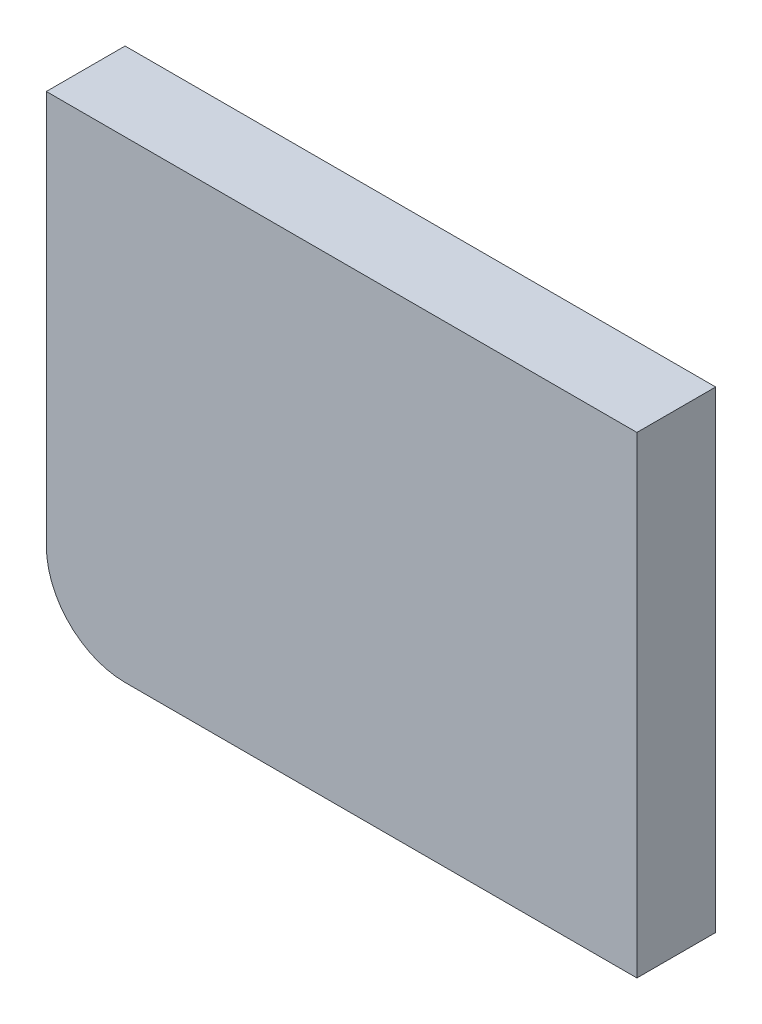
ISO-10303-21;
HEADER;
FILE_DESCRIPTION(('STEP AP214'),'2;1');
FILE_NAME('part.step','',(''),(''),'','','');
FILE_SCHEMA(('AUTOMOTIVE_DESIGN { 1 0 10303 214 1 1 1 1 }'));
ENDSEC;
DATA;
#1=APPLICATION_CONTEXT('core data for automotive mechanical design processes');
#2=APPLICATION_PROTOCOL_DEFINITION('international standard','automotive_design',2000,#1);
#3=PRODUCT_CONTEXT('',#1,'mechanical');
#4=PRODUCT('Part','Part','',(#3));
#5=PRODUCT_RELATED_PRODUCT_CATEGORY('part','',(#4));
#6=PRODUCT_DEFINITION_FORMATION('','',#4);
#7=PRODUCT_DEFINITION_CONTEXT('part definition',#1,'design');
#8=PRODUCT_DEFINITION('design','',#6,#7);
#9=PRODUCT_DEFINITION_SHAPE('','',#8);
#10=(LENGTH_UNIT() NAMED_UNIT(*) SI_UNIT(.MILLI.,.METRE.));
#11=(NAMED_UNIT(*) PLANE_ANGLE_UNIT() SI_UNIT($,.RADIAN.));
#12=(NAMED_UNIT(*) SI_UNIT($,.STERADIAN.) SOLID_ANGLE_UNIT());
#13=UNCERTAINTY_MEASURE_WITH_UNIT(LENGTH_MEASURE(1.E-05),#10,'distance_accuracy_value','');
#14=(GEOMETRIC_REPRESENTATION_CONTEXT(3) GLOBAL_UNCERTAINTY_ASSIGNED_CONTEXT((#13)) GLOBAL_UNIT_ASSIGNED_CONTEXT((#10,
#11,#12)) REPRESENTATION_CONTEXT('',''));
#15=CARTESIAN_POINT('',(0.,0.,0.));
#16=DIRECTION('',(0.,0.,1.));
#17=DIRECTION('',(1.,0.,0.));
#18=AXIS2_PLACEMENT_3D('',#15,#16,#17);
#19=CARTESIAN_POINT('',(-37.821244,0.,2.));
#20=DIRECTION('',(1.,0.,0.));
#21=DIRECTION('',(0.,0.,-1.));
#22=AXIS2_PLACEMENT_3D('',#19,#20,#21);
#23=PLANE('',#22);
#24=DIRECTION('',(0.,-1.,0.));
#25=VECTOR('',#24,1.);
#26=CARTESIAN_POINT('',(-37.821244,0.,0.));
#27=LINE('',#26,#25);
#28=CARTESIAN_POINT('',(-37.821244,4.,0.));
#29=VERTEX_POINT('',#28);
#30=CARTESIAN_POINT('',(-37.821244,-6.,0.));
#31=VERTEX_POINT('',#30);
#32=EDGE_CURVE('E110',#29,#31,#27,.T.);
#33=ORIENTED_EDGE('',*,*,#32,.T.);
#34=DIRECTION('',(0.,0.,-1.));
#35=VECTOR('',#34,1.);
#36=CARTESIAN_POINT('',(-37.821244,-6.,2.));
#37=LINE('',#36,#35);
#38=CARTESIAN_POINT('',(-37.821244,-6.,2.));
#39=VERTEX_POINT('',#38);
#40=EDGE_CURVE('E11',#39,#31,#37,.T.);
#41=ORIENTED_EDGE('',*,*,#40,.F.);
#42=DIRECTION('',(0.,-1.,0.));
#43=VECTOR('',#42,1.);
#44=CARTESIAN_POINT('',(-37.821244,0.,2.));
#45=LINE('',#44,#43);
#46=CARTESIAN_POINT('',(-37.821244,4.,2.));
#47=VERTEX_POINT('',#46);
#48=EDGE_CURVE('E120',#47,#39,#45,.T.);
#49=ORIENTED_EDGE('',*,*,#48,.F.);
#50=DIRECTION('',(0.,0.,-1.));
#51=VECTOR('',#50,1.);
#52=CARTESIAN_POINT('',(-37.821244,4.,2.));
#53=LINE('',#52,#51);
#54=EDGE_CURVE('E51',#47,#29,#53,.T.);
#55=ORIENTED_EDGE('',*,*,#54,.T.);
#56=EDGE_LOOP('',(#33,#41,#49,#55));
#57=FACE_BOUND('',#56,.T.);
#58=ADVANCED_FACE('F35',(#57),#23,.F.);
#59=CARTESIAN_POINT('',(-35.821244,-6.,2.));
#60=DIRECTION('',(0.,0.,-1.));
#61=DIRECTION('',(-1.,0.,0.));
#62=AXIS2_PLACEMENT_3D('',#59,#60,#61);
#63=CYLINDRICAL_SURFACE('',#62,2.);
#64=CARTESIAN_POINT('',(-35.821244,-6.,0.));
#65=DIRECTION('',(0.,0.,1.));
#66=DIRECTION('',(1.,0.,0.));
#67=AXIS2_PLACEMENT_3D('',#64,#65,#66);
#68=CIRCLE('',#67,2.);
#69=CARTESIAN_POINT('',(-35.821244,-8.,0.));
#70=VERTEX_POINT('',#69);
#71=EDGE_CURVE('E112',#31,#70,#68,.T.);
#72=ORIENTED_EDGE('',*,*,#71,.T.);
#73=DIRECTION('',(0.,0.,-1.));
#74=VECTOR('',#73,1.);
#75=CARTESIAN_POINT('',(-35.821244,-8.,2.));
#76=LINE('',#75,#74);
#77=CARTESIAN_POINT('',(-35.821244,-8.,2.));
#78=VERTEX_POINT('',#77);
#79=EDGE_CURVE('E43',#78,#70,#76,.T.);
#80=ORIENTED_EDGE('',*,*,#79,.F.);
#81=CARTESIAN_POINT('',(-35.821244,-6.,2.));
#82=DIRECTION('',(0.,0.,1.));
#83=DIRECTION('',(1.,0.,0.));
#84=AXIS2_PLACEMENT_3D('',#81,#82,#83);
#85=CIRCLE('',#84,2.);
#86=EDGE_CURVE('E80',#39,#78,#85,.T.);
#87=ORIENTED_EDGE('',*,*,#86,.F.);
#88=ORIENTED_EDGE('',*,*,#40,.T.);
#89=EDGE_LOOP('',(#72,#80,#87,#88));
#90=FACE_BOUND('',#89,.T.);
#91=ADVANCED_FACE('F135',(#90),#63,.T.);
#92=CARTESIAN_POINT('',(0.,-8.,2.));
#93=DIRECTION('',(0.,1.,0.));
#94=DIRECTION('',(0.,0.,1.));
#95=AXIS2_PLACEMENT_3D('',#92,#93,#94);
#96=PLANE('',#95);
#97=DIRECTION('',(1.,0.,0.));
#98=VECTOR('',#97,1.);
#99=CARTESIAN_POINT('',(0.,-8.,0.));
#100=LINE('',#99,#98);
#101=CARTESIAN_POINT('',(-22.821244,-8.,0.));
#102=VERTEX_POINT('',#101);
#103=EDGE_CURVE('E100',#70,#102,#100,.T.);
#104=ORIENTED_EDGE('',*,*,#103,.T.);
#105=DIRECTION('',(0.,0.,-1.));
#106=VECTOR('',#105,1.);
#107=CARTESIAN_POINT('',(-22.821244,-8.,2.));
#108=LINE('',#107,#106);
#109=CARTESIAN_POINT('',(-22.821244,-8.,2.));
#110=VERTEX_POINT('',#109);
#111=EDGE_CURVE('E97',#110,#102,#108,.T.);
#112=ORIENTED_EDGE('',*,*,#111,.F.);
#113=DIRECTION('',(1.,0.,0.));
#114=VECTOR('',#113,1.);
#115=CARTESIAN_POINT('',(0.,-8.,2.));
#116=LINE('',#115,#114);
#117=EDGE_CURVE('E87',#78,#110,#116,.T.);
#118=ORIENTED_EDGE('',*,*,#117,.F.);
#119=ORIENTED_EDGE('',*,*,#79,.T.);
#120=EDGE_LOOP('',(#104,#112,#118,#119));
#121=FACE_BOUND('',#120,.T.);
#122=ADVANCED_FACE('F98',(#121),#96,.F.);
#123=CARTESIAN_POINT('',(-22.821244,0.,2.));
#124=DIRECTION('',(1.,0.,0.));
#125=DIRECTION('',(0.,0.,-1.));
#126=AXIS2_PLACEMENT_3D('',#123,#124,#125);
#127=PLANE('',#126);
#128=DIRECTION('',(0.,-1.,0.));
#129=VECTOR('',#128,1.);
#130=CARTESIAN_POINT('',(-22.821244,0.,0.));
#131=LINE('',#130,#129);
#132=CARTESIAN_POINT('',(-22.821244,4.,0.));
#133=VERTEX_POINT('',#132);
#134=EDGE_CURVE('E115',#133,#102,#131,.T.);
#135=ORIENTED_EDGE('',*,*,#134,.F.);
#136=DIRECTION('',(0.,0.,-1.));
#137=VECTOR('',#136,1.);
#138=CARTESIAN_POINT('',(-22.821244,4.,2.));
#139=LINE('',#138,#137);
#140=CARTESIAN_POINT('',(-22.821244,4.,2.));
#141=VERTEX_POINT('',#140);
#142=EDGE_CURVE('E68',#141,#133,#139,.T.);
#143=ORIENTED_EDGE('',*,*,#142,.F.);
#144=DIRECTION('',(0.,-1.,0.));
#145=VECTOR('',#144,1.);
#146=CARTESIAN_POINT('',(-22.821244,0.,2.));
#147=LINE('',#146,#145);
#148=EDGE_CURVE('E92',#141,#110,#147,.T.);
#149=ORIENTED_EDGE('',*,*,#148,.T.);
#150=ORIENTED_EDGE('',*,*,#111,.T.);
#151=EDGE_LOOP('',(#135,#143,#149,#150));
#152=FACE_BOUND('',#151,.T.);
#153=ADVANCED_FACE('F104',(#152),#127,.T.);
#154=CARTESIAN_POINT('',(0.,4.,2.));
#155=DIRECTION('',(0.,1.,0.));
#156=DIRECTION('',(0.,0.,1.));
#157=AXIS2_PLACEMENT_3D('',#154,#155,#156);
#158=PLANE('',#157);
#159=DIRECTION('',(1.,0.,0.));
#160=VECTOR('',#159,1.);
#161=CARTESIAN_POINT('',(0.,4.,0.));
#162=LINE('',#161,#160);
#163=EDGE_CURVE('E117',#29,#133,#162,.T.);
#164=ORIENTED_EDGE('',*,*,#163,.F.);
#165=ORIENTED_EDGE('',*,*,#54,.F.);
#166=DIRECTION('',(1.,0.,0.));
#167=VECTOR('',#166,1.);
#168=CARTESIAN_POINT('',(0.,4.,2.));
#169=LINE('',#168,#167);
#170=EDGE_CURVE('E105',#47,#141,#169,.T.);
#171=ORIENTED_EDGE('',*,*,#170,.T.);
#172=ORIENTED_EDGE('',*,*,#142,.T.);
#173=EDGE_LOOP('',(#164,#165,#171,#172));
#174=FACE_BOUND('',#173,.T.);
#175=ADVANCED_FACE('F124',(#174),#158,.T.);
#176=CARTESIAN_POINT('',(0.,0.,2.));
#177=DIRECTION('',(0.,0.,1.));
#178=DIRECTION('',(1.,0.,0.));
#179=AXIS2_PLACEMENT_3D('',#176,#177,#178);
#180=PLANE('',#179);
#181=ORIENTED_EDGE('',*,*,#48,.T.);
#182=ORIENTED_EDGE('',*,*,#86,.T.);
#183=ORIENTED_EDGE('',*,*,#117,.T.);
#184=ORIENTED_EDGE('',*,*,#148,.F.);
#185=ORIENTED_EDGE('',*,*,#170,.F.);
#186=EDGE_LOOP('',(#181,#182,#183,#184,#185));
#187=FACE_BOUND('',#186,.T.);
#188=ADVANCED_FACE('F89',(#187),#180,.T.);
#189=CARTESIAN_POINT('',(0.,0.,0.));
#190=DIRECTION('',(0.,0.,1.));
#191=DIRECTION('',(1.,0.,0.));
#192=AXIS2_PLACEMENT_3D('',#189,#190,#191);
#193=PLANE('',#192);
#194=ORIENTED_EDGE('',*,*,#32,.F.);
#195=ORIENTED_EDGE('',*,*,#163,.T.);
#196=ORIENTED_EDGE('',*,*,#134,.T.);
#197=ORIENTED_EDGE('',*,*,#103,.F.);
#198=ORIENTED_EDGE('',*,*,#71,.F.);
#199=EDGE_LOOP('',(#194,#195,#196,#197,#198));
#200=FACE_BOUND('',#199,.T.);
#201=ADVANCED_FACE('F123',(#200),#193,.F.);
#202=CLOSED_SHELL('',(#58,#91,#122,#153,#175,#188,#201));
#203=MANIFOLD_SOLID_BREP('B2',#202);
#204=ADVANCED_BREP_SHAPE_REPRESENTATION('',(#18,#203),#14);
#205=SHAPE_DEFINITION_REPRESENTATION(#9,#204);
ENDSEC;
END-ISO-10303-21;
